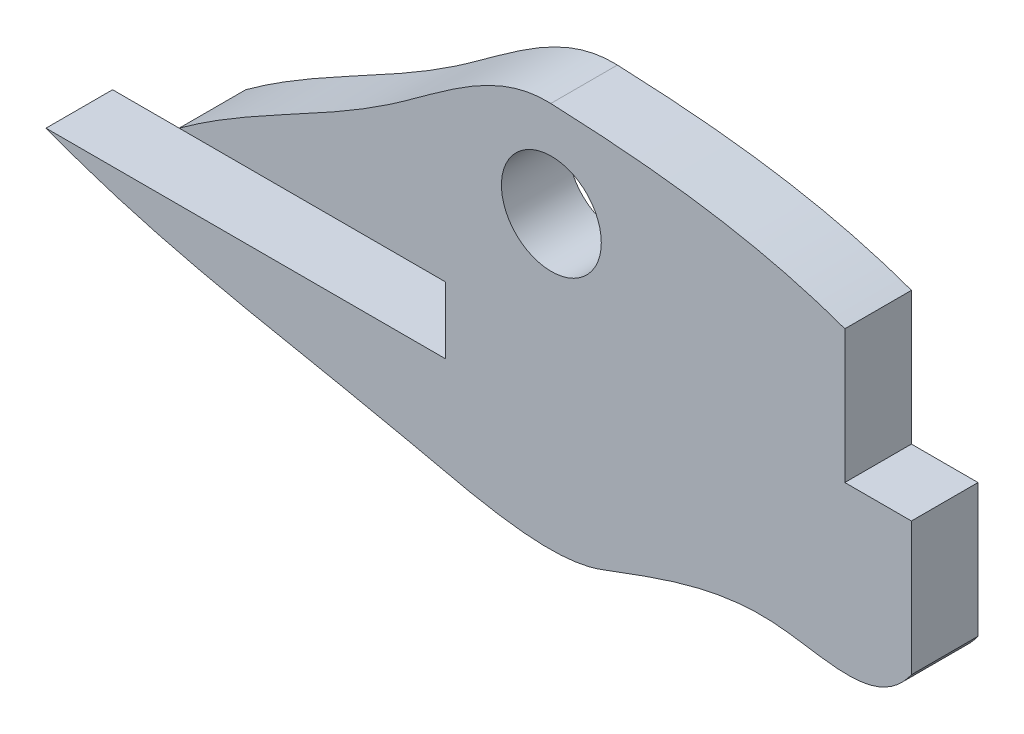
ISO-10303-21;
HEADER;
FILE_DESCRIPTION(('STEP AP214'),'2;1');
FILE_NAME('part.step','',(''),(''),'','','');
FILE_SCHEMA(('AUTOMOTIVE_DESIGN { 1 0 10303 214 1 1 1 1 }'));
ENDSEC;
DATA;
#1=APPLICATION_CONTEXT('core data for automotive mechanical design processes');
#2=APPLICATION_PROTOCOL_DEFINITION('international standard','automotive_design',2000,#1);
#3=PRODUCT_CONTEXT('',#1,'mechanical');
#4=PRODUCT('Part','Part','',(#3));
#5=PRODUCT_RELATED_PRODUCT_CATEGORY('part','',(#4));
#6=PRODUCT_DEFINITION_FORMATION('','',#4);
#7=PRODUCT_DEFINITION_CONTEXT('part definition',#1,'design');
#8=PRODUCT_DEFINITION('design','',#6,#7);
#9=PRODUCT_DEFINITION_SHAPE('','',#8);
#10=(LENGTH_UNIT() NAMED_UNIT(*) SI_UNIT(.MILLI.,.METRE.));
#11=(NAMED_UNIT(*) PLANE_ANGLE_UNIT() SI_UNIT($,.RADIAN.));
#12=(NAMED_UNIT(*) SI_UNIT($,.STERADIAN.) SOLID_ANGLE_UNIT());
#13=UNCERTAINTY_MEASURE_WITH_UNIT(LENGTH_MEASURE(1.E-05),#10,'distance_accuracy_value','');
#14=(GEOMETRIC_REPRESENTATION_CONTEXT(3) GLOBAL_UNCERTAINTY_ASSIGNED_CONTEXT((#13)) GLOBAL_UNIT_ASSIGNED_CONTEXT((#10,
#11,#12)) REPRESENTATION_CONTEXT('',''));
#15=CARTESIAN_POINT('',(0.,0.,0.));
#16=DIRECTION('',(0.,0.,1.));
#17=DIRECTION('',(1.,0.,0.));
#18=AXIS2_PLACEMENT_3D('',#15,#16,#17);
#19=CARTESIAN_POINT('',(-19.05,0.,3.175));
#20=CARTESIAN_POINT('',(-13.1120339705027,-2.27730222987581,3.175));
#21=CARTESIAN_POINT('',(-5.15579563217969,-3.20459496164331,3.175));
#22=CARTESIAN_POINT('',(8.21728826855348,-6.77437823285727,3.175));
#23=CARTESIAN_POINT('',(12.0309484118037,0.93190349478268,3.175));
#24=CARTESIAN_POINT('',(12.9312242312328,8.25930128172846,3.175));
#25=CARTESIAN_POINT('',(4.81641380396603,15.3699549744046,3.175));
#26=CARTESIAN_POINT('',(-3.59227707153999,7.78556744130213,3.175));
#27=CARTESIAN_POINT('',(-9.21538447361065,5.71902759775385,3.175));
#28=CARTESIAN_POINT('',(-12.7,3.175,3.175));
#29=B_SPLINE_CURVE_WITH_KNOTS('',3,(#19,#20,#21,#22,#23,#24,#25,#26,#27,#28),.UNSPECIFIED.,.F.,
.F.,(4,1,1,1,1,1,1,4),(0.,0.256909302616327,0.405237786806961,0.477393102593604,
0.59131784021633,0.708774719473176,0.830232281654779,1.),.UNSPECIFIED.);
#30=DIRECTION('',(0.,0.,-1.));
#31=VECTOR('',#30,1.);
#32=SURFACE_OF_LINEAR_EXTRUSION('',#29,#31);
#33=DIRECTION('',(0.,0.,-1.));
#34=VECTOR('',#33,1.);
#35=CARTESIAN_POINT('',(-12.7,3.175,3.175));
#36=LINE('',#35,#34);
#37=CARTESIAN_POINT('',(-12.7,3.175,3.175));
#38=VERTEX_POINT('',#37);
#39=CARTESIAN_POINT('',(-12.7,3.175,0.));
#40=VERTEX_POINT('',#39);
#41=EDGE_CURVE('E174',#38,#40,#36,.T.);
#42=ORIENTED_EDGE('',*,*,#41,.F.);
#43=CARTESIAN_POINT('',(4.98841894379567,13.0566495799808,3.175));
#44=VERTEX_POINT('',#43);
#45=EDGE_CURVE('E166',#44,#38,#29,.T.);
#46=ORIENTED_EDGE('',*,*,#45,.F.);
#47=CARTESIAN_POINT('',(5.02285064021654,13.0552113048573,3.175));
#48=CARTESIAN_POINT('',(5.01711295233193,13.0554732377458,3.175));
#49=CARTESIAN_POINT('',(5.01137480035455,13.0557240604504,3.175));
#50=CARTESIAN_POINT('',(4.99989756821426,13.0562034854915,3.175));
#51=CARTESIAN_POINT('',(4.99415848805134,13.0564320878281,3.175));
#52=CARTESIAN_POINT('',(4.98841894379567,13.0566495799808,3.175));
#53=B_SPLINE_CURVE_WITH_KNOTS('',3,(#47,#48,#49,#50,#51,#52),.UNSPECIFIED.,.F.,.F.,(4,2,4),(0.,
0.0172308938044917,0.0344617876089832),.UNSPECIFIED.);
#54=CARTESIAN_POINT('',(5.02285064021654,13.0552113048573,3.175));
#55=VERTEX_POINT('',#54);
#56=EDGE_CURVE('E11',#55,#44,#53,.T.);
#57=ORIENTED_EDGE('',*,*,#56,.F.);
#58=DIRECTION('',(0.,0.,1.));
#59=VECTOR('',#58,1.);
#60=CARTESIAN_POINT('',(5.02285381230256,13.0552111600401,0.));
#61=LINE('',#60,#59);
#62=CARTESIAN_POINT('',(5.02285335221561,13.0552111810449,0.));
#63=VERTEX_POINT('',#62);
#64=EDGE_CURVE('E176',#63,#55,#61,.T.);
#65=ORIENTED_EDGE('',*,*,#64,.F.);
#66=CARTESIAN_POINT('',(5.02285335221561,13.0552111810449,0.));
#67=CARTESIAN_POINT('',(5.01711521248429,13.0554731380722,0.));
#68=CARTESIAN_POINT('',(5.01137660858363,13.0557239831639,0.));
#69=CARTESIAN_POINT('',(4.99989847244365,13.0562034494759,0.));
#70=CARTESIAN_POINT('',(4.99415894020433,13.0564320706962,0.));
#71=CARTESIAN_POINT('',(4.98841894379567,13.0566495799808,0.));
#72=B_SPLINE_CURVE_WITH_KNOTS('',3,(#66,#67,#68,#69,#70,#71),.UNSPECIFIED.,.F.,.F.,(4,2,4),(0.,
0.0172322512138619,0.0344645024277245),.UNSPECIFIED.);
#73=CARTESIAN_POINT('',(4.98841894379567,13.0566495799808,0.));
#74=VERTEX_POINT('',#73);
#75=EDGE_CURVE('E49',#63,#74,#72,.T.);
#76=ORIENTED_EDGE('',*,*,#75,.T.);
#77=CARTESIAN_POINT('',(-19.05,0.,0.));
#78=CARTESIAN_POINT('',(-13.1120339705027,-2.27730222987581,0.));
#79=CARTESIAN_POINT('',(-5.15579563217969,-3.20459496164331,0.));
#80=CARTESIAN_POINT('',(8.21728826855348,-6.77437823285727,0.));
#81=CARTESIAN_POINT('',(12.0309484118037,0.93190349478268,0.));
#82=CARTESIAN_POINT('',(12.9312242312328,8.25930128172846,0.));
#83=CARTESIAN_POINT('',(4.81641380396603,15.3699549744046,0.));
#84=CARTESIAN_POINT('',(-3.59227707153999,7.78556744130213,0.));
#85=CARTESIAN_POINT('',(-9.21538447361065,5.71902759775385,0.));
#86=CARTESIAN_POINT('',(-12.7,3.175,0.));
#87=B_SPLINE_CURVE_WITH_KNOTS('',3,(#77,#78,#79,#80,#81,#82,#83,#84,#85,#86),.UNSPECIFIED.,.F.,
.F.,(4,1,1,1,1,1,1,4),(0.,0.256909302616327,0.405237786806961,0.477393102593604,
0.59131784021633,0.708774719473176,0.830232281654779,1.),.UNSPECIFIED.);
#88=EDGE_CURVE('E149',#74,#40,#87,.T.);
#89=ORIENTED_EDGE('',*,*,#88,.T.);
#90=EDGE_LOOP('',(#42,#46,#57,#65,#76,#89));
#91=FACE_BOUND('',#90,.T.);
#92=ADVANCED_FACE('F35',(#91),#32,.F.);
#93=CARTESIAN_POINT('',(11.7937242584045,1.59838785225866,3.175));
#94=DIRECTION('',(0.,0.,-1.));
#95=DIRECTION('',(-1.,0.,0.));
#96=AXIS2_PLACEMENT_3D('',#93,#94,#95);
#97=PLANE('',#96);
#98=CARTESIAN_POINT('',(-19.05,0.,3.175));
#99=VERTEX_POINT('',#98);
#100=CARTESIAN_POINT('',(7.56927336750202,-4.93526216959436,3.175));
#101=VERTEX_POINT('',#100);
#102=EDGE_CURVE('E217',#99,#101,#29,.T.);
#103=ORIENTED_EDGE('',*,*,#102,.T.);
#104=CARTESIAN_POINT('',(7.56927336692067,-4.93526216982538,3.175));
#105=CARTESIAN_POINT('',(10.1773883971396,-3.97309816257101,3.175));
#106=CARTESIAN_POINT('',(15.1510252010586,-1.96874673490952,3.175));
#107=CARTESIAN_POINT('',(20.5325852994413,-4.30747657588415,3.175));
#108=CARTESIAN_POINT('',(22.2181255395319,-1.9383720187973,3.175));
#109=B_SPLINE_CURVE_WITH_KNOTS('',3,(#104,#105,#106,#107,#108),.UNSPECIFIED.,.F.,.F.,(4,1,4),
(0.,0.552836203920181,1.),.UNSPECIFIED.);
#110=CARTESIAN_POINT('',(22.2181255395319,-1.9383720187973,3.175));
#111=VERTEX_POINT('',#110);
#112=EDGE_CURVE('E126',#101,#111,#109,.T.);
#113=ORIENTED_EDGE('',*,*,#112,.T.);
#114=DIRECTION('',(0.,-1.,0.));
#115=VECTOR('',#114,1.);
#116=CARTESIAN_POINT('',(22.2181255395319,0.,3.175));
#117=LINE('',#116,#115);
#118=CARTESIAN_POINT('',(22.2181255395319,4.41162798120273,3.175));
#119=VERTEX_POINT('',#118);
#120=EDGE_CURVE('E252',#119,#111,#117,.T.);
#121=ORIENTED_EDGE('',*,*,#120,.F.);
#122=DIRECTION('',(-1.,0.,0.));
#123=VECTOR('',#122,1.);
#124=CARTESIAN_POINT('',(0.,4.41162798120273,3.175));
#125=LINE('',#124,#123);
#126=CARTESIAN_POINT('',(19.0431255395319,4.41162798120273,3.175));
#127=VERTEX_POINT('',#126);
#128=EDGE_CURVE('E249',#119,#127,#125,.T.);
#129=ORIENTED_EDGE('',*,*,#128,.T.);
#130=DIRECTION('',(0.,-1.,0.));
#131=VECTOR('',#130,1.);
#132=CARTESIAN_POINT('',(19.0431255395319,0.,3.175));
#133=LINE('',#132,#131);
#134=CARTESIAN_POINT('',(19.0431255395319,10.7616279812027,3.175));
#135=VERTEX_POINT('',#134);
#136=EDGE_CURVE('E243',#135,#127,#133,.T.);
#137=ORIENTED_EDGE('',*,*,#136,.F.);
#138=CARTESIAN_POINT('',(4.98815095947564,13.0566597273243,3.175));
#139=CARTESIAN_POINT('',(9.71874365625886,12.8598552156402,3.175));
#140=CARTESIAN_POINT('',(14.559374774159,12.3892709481629,3.175));
#141=CARTESIAN_POINT('',(19.0431255395319,10.7616279812027,3.175));
#142=B_SPLINE_CURVE_WITH_KNOTS('',3,(#138,#139,#140,#141),.UNSPECIFIED.,.F.,.F.,(4,4),(0.,1.),.UNSPECIFIED.);
#143=EDGE_CURVE('E59',#55,#135,#142,.T.);
#144=ORIENTED_EDGE('',*,*,#143,.F.);
#145=ORIENTED_EDGE('',*,*,#56,.T.);
#146=ORIENTED_EDGE('',*,*,#45,.T.);
#147=DIRECTION('',(1.,0.,0.));
#148=VECTOR('',#147,1.);
#149=CARTESIAN_POINT('',(0.,3.175,3.175));
#150=LINE('',#149,#148);
#151=CARTESIAN_POINT('',(0.,3.175,3.175));
#152=VERTEX_POINT('',#151);
#153=EDGE_CURVE('E214',#38,#152,#150,.T.);
#154=ORIENTED_EDGE('',*,*,#153,.T.);
#155=DIRECTION('',(0.,-1.,0.));
#156=VECTOR('',#155,1.);
#157=CARTESIAN_POINT('',(0.,0.,3.175));
#158=LINE('',#157,#156);
#159=CARTESIAN_POINT('',(0.,0.,3.175));
#160=VERTEX_POINT('',#159);
#161=EDGE_CURVE('E216',#152,#160,#158,.T.);
#162=ORIENTED_EDGE('',*,*,#161,.T.);
#163=DIRECTION('',(-1.,0.,0.));
#164=VECTOR('',#163,1.);
#165=CARTESIAN_POINT('',(-19.05,0.,3.175));
#166=LINE('',#165,#164);
#167=EDGE_CURVE('E157',#160,#99,#166,.T.);
#168=ORIENTED_EDGE('',*,*,#167,.T.);
#169=EDGE_LOOP('',(#103,#113,#121,#129,#137,#144,#145,#146,#154,#162,#168));
#170=FACE_BOUND('',#169,.T.);
#171=CARTESIAN_POINT('',(5.04836747499998,8.51005190950715,3.175));
#172=DIRECTION('',(0.,0.,1.));
#173=DIRECTION('',(1.,0.,0.));
#174=AXIS2_PLACEMENT_3D('',#171,#172,#173);
#175=CIRCLE('',#174,2.38125);
#176=CARTESIAN_POINT('',(7.42961747499998,8.51005190950715,3.175));
#177=VERTEX_POINT('',#176);
#178=EDGE_CURVE('E153',#177,#177,#175,.T.);
#179=ORIENTED_EDGE('',*,*,#178,.F.);
#180=EDGE_LOOP('',(#179));
#181=FACE_BOUND('',#180,.T.);
#182=ADVANCED_FACE('F185',(#170,#181),#97,.F.);
#183=CARTESIAN_POINT('',(11.7937242584045,1.59838785225866,0.));
#184=DIRECTION('',(0.,0.,-1.));
#185=DIRECTION('',(-1.,0.,0.));
#186=AXIS2_PLACEMENT_3D('',#183,#184,#185);
#187=PLANE('',#186);
#188=CARTESIAN_POINT('',(7.56927336692067,-4.93526216982538,0.));
#189=CARTESIAN_POINT('',(10.1773883971396,-3.97309816257101,0.));
#190=CARTESIAN_POINT('',(15.1510252010586,-1.96874673490952,0.));
#191=CARTESIAN_POINT('',(20.5325852994413,-4.30747657588415,0.));
#192=CARTESIAN_POINT('',(22.2181255395319,-1.9383720187973,0.));
#193=B_SPLINE_CURVE_WITH_KNOTS('',3,(#188,#189,#190,#191,#192),.UNSPECIFIED.,.F.,.F.,(4,1,4),
(0.,0.552836203920181,1.),.UNSPECIFIED.);
#194=CARTESIAN_POINT('',(7.56927336750202,-4.93526216959436,0.));
#195=VERTEX_POINT('',#194);
#196=CARTESIAN_POINT('',(22.2181255395319,-1.9383720187973,0.));
#197=VERTEX_POINT('',#196);
#198=EDGE_CURVE('E124',#195,#197,#193,.T.);
#199=ORIENTED_EDGE('',*,*,#198,.F.);
#200=CARTESIAN_POINT('',(-19.05,0.,0.));
#201=VERTEX_POINT('',#200);
#202=EDGE_CURVE('E139',#201,#195,#87,.T.);
#203=ORIENTED_EDGE('',*,*,#202,.F.);
#204=DIRECTION('',(-1.,0.,0.));
#205=VECTOR('',#204,1.);
#206=CARTESIAN_POINT('',(-19.05,0.,0.));
#207=LINE('',#206,#205);
#208=CARTESIAN_POINT('',(0.,0.,0.));
#209=VERTEX_POINT('',#208);
#210=EDGE_CURVE('E164',#209,#201,#207,.T.);
#211=ORIENTED_EDGE('',*,*,#210,.F.);
#212=DIRECTION('',(0.,-1.,0.));
#213=VECTOR('',#212,1.);
#214=CARTESIAN_POINT('',(0.,0.,0.));
#215=LINE('',#214,#213);
#216=CARTESIAN_POINT('',(0.,3.175,0.));
#217=VERTEX_POINT('',#216);
#218=EDGE_CURVE('E151',#217,#209,#215,.T.);
#219=ORIENTED_EDGE('',*,*,#218,.F.);
#220=DIRECTION('',(1.,0.,0.));
#221=VECTOR('',#220,1.);
#222=CARTESIAN_POINT('',(0.,3.175,0.));
#223=LINE('',#222,#221);
#224=EDGE_CURVE('E148',#40,#217,#223,.T.);
#225=ORIENTED_EDGE('',*,*,#224,.F.);
#226=ORIENTED_EDGE('',*,*,#88,.F.);
#227=ORIENTED_EDGE('',*,*,#75,.F.);
#228=CARTESIAN_POINT('',(4.98815095947564,13.0566597273243,0.));
#229=CARTESIAN_POINT('',(9.71874365625886,12.8598552156402,0.));
#230=CARTESIAN_POINT('',(14.559374774159,12.3892709481629,0.));
#231=CARTESIAN_POINT('',(19.0431255395319,10.7616279812027,0.));
#232=B_SPLINE_CURVE_WITH_KNOTS('',3,(#228,#229,#230,#231),.UNSPECIFIED.,.F.,.F.,(4,4),(0.,1.),.UNSPECIFIED.);
#233=CARTESIAN_POINT('',(19.0431255395319,10.7616279812027,0.));
#234=VERTEX_POINT('',#233);
#235=EDGE_CURVE('E132',#63,#234,#232,.T.);
#236=ORIENTED_EDGE('',*,*,#235,.T.);
#237=DIRECTION('',(0.,-1.,0.));
#238=VECTOR('',#237,1.);
#239=CARTESIAN_POINT('',(19.0431255395319,0.,0.));
#240=LINE('',#239,#238);
#241=CARTESIAN_POINT('',(19.0431255395319,4.41162798120273,0.));
#242=VERTEX_POINT('',#241);
#243=EDGE_CURVE('E265',#234,#242,#240,.T.);
#244=ORIENTED_EDGE('',*,*,#243,.T.);
#245=DIRECTION('',(-1.,0.,0.));
#246=VECTOR('',#245,1.);
#247=CARTESIAN_POINT('',(0.,4.41162798120273,0.));
#248=LINE('',#247,#246);
#249=CARTESIAN_POINT('',(22.2181255395319,4.41162798120273,0.));
#250=VERTEX_POINT('',#249);
#251=EDGE_CURVE('E295',#250,#242,#248,.T.);
#252=ORIENTED_EDGE('',*,*,#251,.F.);
#253=DIRECTION('',(0.,-1.,0.));
#254=VECTOR('',#253,1.);
#255=CARTESIAN_POINT('',(22.2181255395319,0.,0.));
#256=LINE('',#255,#254);
#257=EDGE_CURVE('E142',#250,#197,#256,.T.);
#258=ORIENTED_EDGE('',*,*,#257,.T.);
#259=EDGE_LOOP('',(#199,#203,#211,#219,#225,#226,#227,#236,#244,#252,#258));
#260=FACE_BOUND('',#259,.T.);
#261=CARTESIAN_POINT('',(5.04836747499998,8.51005190950715,0.));
#262=DIRECTION('',(0.,0.,1.));
#263=DIRECTION('',(1.,0.,0.));
#264=AXIS2_PLACEMENT_3D('',#261,#262,#263);
#265=CIRCLE('',#264,2.38125);
#266=CARTESIAN_POINT('',(7.42961747499998,8.51005190950715,0.));
#267=VERTEX_POINT('',#266);
#268=EDGE_CURVE('E223',#267,#267,#265,.T.);
#269=ORIENTED_EDGE('',*,*,#268,.T.);
#270=EDGE_LOOP('',(#269));
#271=FACE_BOUND('',#270,.T.);
#272=ADVANCED_FACE('F136',(#260,#271),#187,.T.);
#273=ORIENTED_EDGE('',*,*,#202,.T.);
#274=DIRECTION('',(0.,0.,1.));
#275=VECTOR('',#274,1.);
#276=CARTESIAN_POINT('',(7.56927336750202,-4.93526216959436,0.));
#277=LINE('',#276,#275);
#278=EDGE_CURVE('E121',#195,#101,#277,.T.);
#279=ORIENTED_EDGE('',*,*,#278,.T.);
#280=ORIENTED_EDGE('',*,*,#102,.F.);
#281=DIRECTION('',(0.,0.,-1.));
#282=VECTOR('',#281,1.);
#283=CARTESIAN_POINT('',(-19.05,0.,3.175));
#284=LINE('',#283,#282);
#285=EDGE_CURVE('E147',#99,#201,#284,.T.);
#286=ORIENTED_EDGE('',*,*,#285,.T.);
#287=EDGE_LOOP('',(#273,#279,#280,#286));
#288=FACE_BOUND('',#287,.T.);
#289=ADVANCED_FACE('F37',(#288),#32,.F.);
#290=CARTESIAN_POINT('',(0.,3.175,3.175));
#291=DIRECTION('',(0.,1.,0.));
#292=DIRECTION('',(-1.,0.,0.));
#293=AXIS2_PLACEMENT_3D('',#290,#291,#292);
#294=PLANE('',#293);
#295=ORIENTED_EDGE('',*,*,#224,.T.);
#296=DIRECTION('',(0.,0.,-1.));
#297=VECTOR('',#296,1.);
#298=CARTESIAN_POINT('',(0.,3.175,3.175));
#299=LINE('',#298,#297);
#300=EDGE_CURVE('E171',#152,#217,#299,.T.);
#301=ORIENTED_EDGE('',*,*,#300,.F.);
#302=ORIENTED_EDGE('',*,*,#153,.F.);
#303=ORIENTED_EDGE('',*,*,#41,.T.);
#304=EDGE_LOOP('',(#295,#301,#302,#303));
#305=FACE_BOUND('',#304,.T.);
#306=ADVANCED_FACE('F195',(#305),#294,.F.);
#307=CARTESIAN_POINT('',(0.,0.,3.175));
#308=DIRECTION('',(1.,0.,0.));
#309=DIRECTION('',(0.,0.,-1.));
#310=AXIS2_PLACEMENT_3D('',#307,#308,#309);
#311=PLANE('',#310);
#312=ORIENTED_EDGE('',*,*,#218,.T.);
#313=DIRECTION('',(0.,0.,-1.));
#314=VECTOR('',#313,1.);
#315=CARTESIAN_POINT('',(0.,0.,3.175));
#316=LINE('',#315,#314);
#317=EDGE_CURVE('E168',#160,#209,#316,.T.);
#318=ORIENTED_EDGE('',*,*,#317,.F.);
#319=ORIENTED_EDGE('',*,*,#161,.F.);
#320=ORIENTED_EDGE('',*,*,#300,.T.);
#321=EDGE_LOOP('',(#312,#318,#319,#320));
#322=FACE_BOUND('',#321,.T.);
#323=ADVANCED_FACE('F192',(#322),#311,.F.);
#324=CARTESIAN_POINT('',(-19.05,0.,3.175));
#325=DIRECTION('',(0.,-1.,0.));
#326=DIRECTION('',(0.,0.,-1.));
#327=AXIS2_PLACEMENT_3D('',#324,#325,#326);
#328=PLANE('',#327);
#329=ORIENTED_EDGE('',*,*,#210,.T.);
#330=ORIENTED_EDGE('',*,*,#285,.F.);
#331=ORIENTED_EDGE('',*,*,#167,.F.);
#332=ORIENTED_EDGE('',*,*,#317,.T.);
#333=EDGE_LOOP('',(#329,#330,#331,#332));
#334=FACE_BOUND('',#333,.T.);
#335=ADVANCED_FACE('F188',(#334),#328,.F.);
#336=CARTESIAN_POINT('',(5.04836747499998,8.51005190950715,3.175));
#337=DIRECTION('',(0.,0.,-1.));
#338=DIRECTION('',(-1.,0.,0.));
#339=AXIS2_PLACEMENT_3D('',#336,#337,#338);
#340=CYLINDRICAL_SURFACE('',#339,2.38125);
#341=ORIENTED_EDGE('',*,*,#178,.T.);
#342=EDGE_LOOP('',(#341));
#343=FACE_BOUND('',#342,.T.);
#344=ORIENTED_EDGE('',*,*,#268,.F.);
#345=EDGE_LOOP('',(#344));
#346=FACE_BOUND('',#345,.T.);
#347=ADVANCED_FACE('F191',(#343,#346),#340,.F.);
#348=DIRECTION('',(0.,0.,1.));
#349=VECTOR('',#348,1.);
#350=SURFACE_OF_LINEAR_EXTRUSION('',#232,#349);
#351=ORIENTED_EDGE('',*,*,#235,.F.);
#352=ORIENTED_EDGE('',*,*,#64,.T.);
#353=ORIENTED_EDGE('',*,*,#143,.T.);
#354=DIRECTION('',(0.,0.,1.));
#355=VECTOR('',#354,1.);
#356=CARTESIAN_POINT('',(19.0431255395319,10.7616279812027,0.));
#357=LINE('',#356,#355);
#358=EDGE_CURVE('E229',#234,#135,#357,.T.);
#359=ORIENTED_EDGE('',*,*,#358,.F.);
#360=EDGE_LOOP('',(#351,#352,#353,#359));
#361=FACE_BOUND('',#360,.T.);
#362=ADVANCED_FACE('F271',(#361),#350,.F.);
#363=CARTESIAN_POINT('',(19.0431255395319,0.,0.));
#364=DIRECTION('',(-1.,0.,0.));
#365=DIRECTION('',(0.,0.,1.));
#366=AXIS2_PLACEMENT_3D('',#363,#364,#365);
#367=PLANE('',#366);
#368=ORIENTED_EDGE('',*,*,#136,.T.);
#369=DIRECTION('',(0.,0.,1.));
#370=VECTOR('',#369,1.);
#371=CARTESIAN_POINT('',(19.0431255395319,4.41162798120273,0.));
#372=LINE('',#371,#370);
#373=EDGE_CURVE('E236',#242,#127,#372,.T.);
#374=ORIENTED_EDGE('',*,*,#373,.F.);
#375=ORIENTED_EDGE('',*,*,#243,.F.);
#376=ORIENTED_EDGE('',*,*,#358,.T.);
#377=EDGE_LOOP('',(#368,#374,#375,#376));
#378=FACE_BOUND('',#377,.T.);
#379=ADVANCED_FACE('F274',(#378),#367,.F.);
#380=CARTESIAN_POINT('',(0.,4.41162798120273,0.));
#381=DIRECTION('',(0.,1.,0.));
#382=DIRECTION('',(0.,0.,1.));
#383=AXIS2_PLACEMENT_3D('',#380,#381,#382);
#384=PLANE('',#383);
#385=ORIENTED_EDGE('',*,*,#128,.F.);
#386=DIRECTION('',(0.,0.,1.));
#387=VECTOR('',#386,1.);
#388=CARTESIAN_POINT('',(22.2181255395319,4.41162798120273,0.));
#389=LINE('',#388,#387);
#390=EDGE_CURVE('E234',#250,#119,#389,.T.);
#391=ORIENTED_EDGE('',*,*,#390,.F.);
#392=ORIENTED_EDGE('',*,*,#251,.T.);
#393=ORIENTED_EDGE('',*,*,#373,.T.);
#394=EDGE_LOOP('',(#385,#391,#392,#393));
#395=FACE_BOUND('',#394,.T.);
#396=ADVANCED_FACE('F278',(#395),#384,.T.);
#397=CARTESIAN_POINT('',(22.2181255395319,0.,0.));
#398=DIRECTION('',(-1.,0.,0.));
#399=DIRECTION('',(0.,0.,1.));
#400=AXIS2_PLACEMENT_3D('',#397,#398,#399);
#401=PLANE('',#400);
#402=ORIENTED_EDGE('',*,*,#120,.T.);
#403=DIRECTION('',(0.,0.,1.));
#404=VECTOR('',#403,1.);
#405=CARTESIAN_POINT('',(22.2181255395319,-1.9383720187973,0.));
#406=LINE('',#405,#404);
#407=EDGE_CURVE('E131',#197,#111,#406,.T.);
#408=ORIENTED_EDGE('',*,*,#407,.F.);
#409=ORIENTED_EDGE('',*,*,#257,.F.);
#410=ORIENTED_EDGE('',*,*,#390,.T.);
#411=EDGE_LOOP('',(#402,#408,#409,#410));
#412=FACE_BOUND('',#411,.T.);
#413=ADVANCED_FACE('F282',(#412),#401,.F.);
#414=DIRECTION('',(0.,0.,1.));
#415=VECTOR('',#414,1.);
#416=SURFACE_OF_LINEAR_EXTRUSION('',#193,#415);
#417=ORIENTED_EDGE('',*,*,#112,.F.);
#418=ORIENTED_EDGE('',*,*,#278,.F.);
#419=ORIENTED_EDGE('',*,*,#198,.T.);
#420=ORIENTED_EDGE('',*,*,#407,.T.);
#421=EDGE_LOOP('',(#417,#418,#419,#420));
#422=FACE_BOUND('',#421,.T.);
#423=ADVANCED_FACE('F123',(#422),#416,.T.);
#424=CLOSED_SHELL('',(#92,#182,#272,#289,#306,#323,#335,#347,#362,#379,#396,#413,#423));
#425=MANIFOLD_SOLID_BREP('B2',#424);
#426=ADVANCED_BREP_SHAPE_REPRESENTATION('',(#18,#425),#14);
#427=SHAPE_DEFINITION_REPRESENTATION(#9,#426);
ENDSEC;
END-ISO-10303-21;
